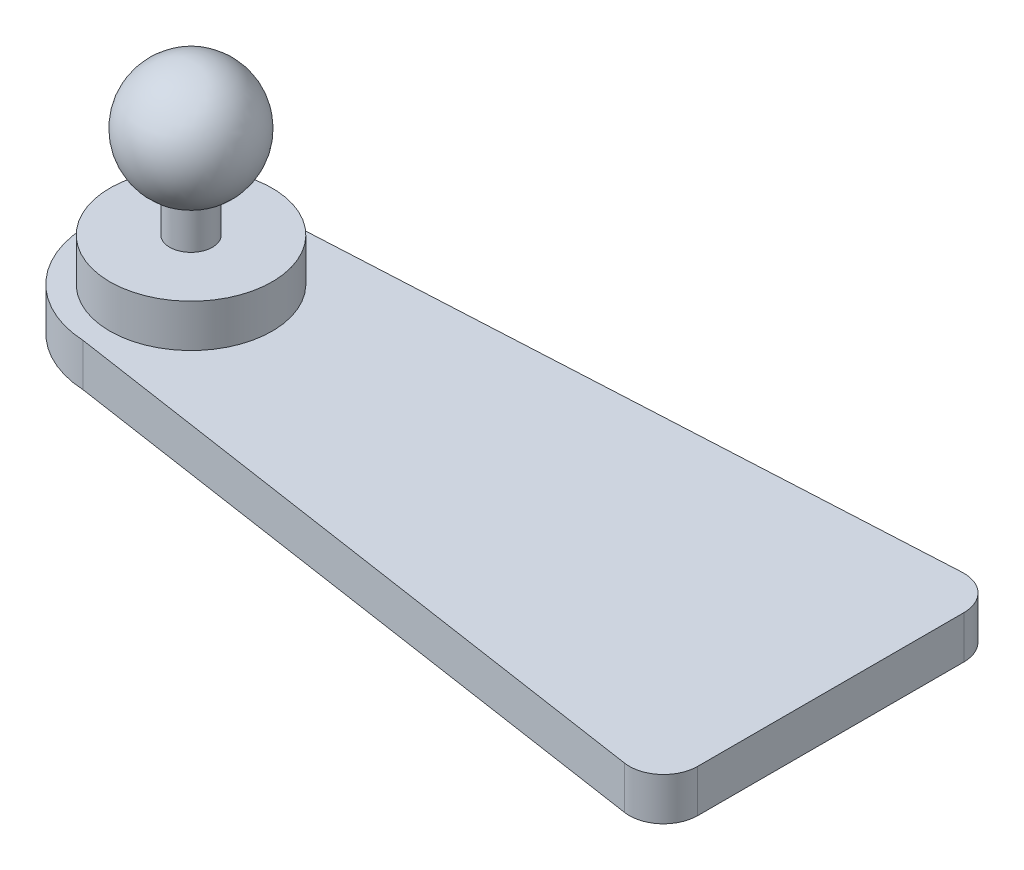
ISO-10303-21;
HEADER;
FILE_DESCRIPTION(('STEP AP214'),'2;1');
FILE_NAME('part.step','',(''),(''),'','','');
FILE_SCHEMA(('AUTOMOTIVE_DESIGN { 1 0 10303 214 1 1 1 1 }'));
ENDSEC;
DATA;
#1=APPLICATION_CONTEXT('core data for automotive mechanical design processes');
#2=APPLICATION_PROTOCOL_DEFINITION('international standard','automotive_design',2000,#1);
#3=PRODUCT_CONTEXT('',#1,'mechanical');
#4=PRODUCT('Part','Part','',(#3));
#5=PRODUCT_RELATED_PRODUCT_CATEGORY('part','',(#4));
#6=PRODUCT_DEFINITION_FORMATION('','',#4);
#7=PRODUCT_DEFINITION_CONTEXT('part definition',#1,'design');
#8=PRODUCT_DEFINITION('design','',#6,#7);
#9=PRODUCT_DEFINITION_SHAPE('','',#8);
#10=(LENGTH_UNIT() NAMED_UNIT(*) SI_UNIT(.MILLI.,.METRE.));
#11=(NAMED_UNIT(*) PLANE_ANGLE_UNIT() SI_UNIT($,.RADIAN.));
#12=(NAMED_UNIT(*) SI_UNIT($,.STERADIAN.) SOLID_ANGLE_UNIT());
#13=UNCERTAINTY_MEASURE_WITH_UNIT(LENGTH_MEASURE(1.E-05),#10,'distance_accuracy_value','');
#14=(GEOMETRIC_REPRESENTATION_CONTEXT(3) GLOBAL_UNCERTAINTY_ASSIGNED_CONTEXT((#13)) GLOBAL_UNIT_ASSIGNED_CONTEXT((#10,
#11,#12)) REPRESENTATION_CONTEXT('',''));
#15=CARTESIAN_POINT('',(0.,0.,0.));
#16=DIRECTION('',(0.,0.,1.));
#17=DIRECTION('',(1.,0.,0.));
#18=AXIS2_PLACEMENT_3D('',#15,#16,#17);
#19=CARTESIAN_POINT('',(15.8376395718531,3.175,-15.5747968755343));
#20=DIRECTION('',(0.052455693553448,0.,0.998623252389922));
#21=DIRECTION('',(0.998623252389922,0.,-0.052455693553448));
#22=AXIS2_PLACEMENT_3D('',#19,#20,#21);
#23=PLANE('',#22);
#24=DIRECTION('',(-0.998623252389923,0.,0.052455693553448));
#25=VECTOR('',#24,1.);
#26=CARTESIAN_POINT('',(15.8376395718531,3.175,-15.5747968755343));
#27=LINE('',#26,#25);
#28=CARTESIAN_POINT('',(13.1644021102273,3.175,-15.4343770277618));
#29=VERTEX_POINT('',#28);
#30=CARTESIAN_POINT('',(-34.4025316455696,3.175,-12.9357805907173));
#31=VERTEX_POINT('',#30);
#32=EDGE_CURVE('E105',#29,#31,#27,.T.);
#33=ORIENTED_EDGE('',*,*,#32,.F.);
#34=DIRECTION('',(0.,-1.,0.));
#35=VECTOR('',#34,1.);
#36=CARTESIAN_POINT('',(13.1644021102273,3.175,-15.4343770277618));
#37=LINE('',#36,#35);
#38=CARTESIAN_POINT('',(13.1644021102273,0.,-15.4343770277618));
#39=VERTEX_POINT('',#38);
#40=EDGE_CURVE('E132',#29,#39,#37,.T.);
#41=ORIENTED_EDGE('',*,*,#40,.T.);
#42=DIRECTION('',(-0.998623252389923,0.,0.052455693553448));
#43=VECTOR('',#42,1.);
#44=CARTESIAN_POINT('',(15.8376395718531,0.,-15.5747968755343));
#45=LINE('',#44,#43);
#46=CARTESIAN_POINT('',(-34.4025316455696,0.,-12.9357805907173));
#47=VERTEX_POINT('',#46);
#48=EDGE_CURVE('E129',#39,#47,#45,.T.);
#49=ORIENTED_EDGE('',*,*,#48,.T.);
#50=DIRECTION('',(0.,-1.,0.));
#51=VECTOR('',#50,1.);
#52=CARTESIAN_POINT('',(-34.4025316455696,3.175,-12.9357805907173));
#53=LINE('',#52,#51);
#54=EDGE_CURVE('E122',#31,#47,#53,.T.);
#55=ORIENTED_EDGE('',*,*,#54,.F.);
#56=EDGE_LOOP('',(#33,#41,#49,#55));
#57=FACE_BOUND('',#56,.T.);
#58=ADVANCED_FACE('F42',(#57),#23,.F.);
#59=CARTESIAN_POINT('',(-34.0022681989488,3.175,-5.3157805907173));
#60=DIRECTION('',(0.,-1.,0.));
#61=DIRECTION('',(0.,0.,-1.));
#62=AXIS2_PLACEMENT_3D('',#59,#60,#61);
#63=CYLINDRICAL_SURFACE('',#62,7.6305052799078);
#64=CARTESIAN_POINT('',(-34.0022681989488,0.,-5.3157805907173));
#65=DIRECTION('',(0.,1.,0.));
#66=DIRECTION('',(0.,0.,1.));
#67=AXIS2_PLACEMENT_3D('',#64,#65,#66);
#68=CIRCLE('',#67,7.6305052799078);
#69=CARTESIAN_POINT('',(-34.4025316455696,0.,2.3042194092827));
#70=VERTEX_POINT('',#69);
#71=EDGE_CURVE('E181',#47,#70,#68,.T.);
#72=ORIENTED_EDGE('',*,*,#71,.T.);
#73=DIRECTION('',(0.,-1.,0.));
#74=VECTOR('',#73,1.);
#75=CARTESIAN_POINT('',(-34.4025316455696,3.175,2.3042194092827));
#76=LINE('',#75,#74);
#77=CARTESIAN_POINT('',(-34.4025316455696,3.175,2.3042194092827));
#78=VERTEX_POINT('',#77);
#79=EDGE_CURVE('E124',#78,#70,#76,.T.);
#80=ORIENTED_EDGE('',*,*,#79,.F.);
#81=CARTESIAN_POINT('',(-34.0022681989488,3.175,-5.3157805907173));
#82=DIRECTION('',(0.,1.,0.));
#83=DIRECTION('',(0.,0.,1.));
#84=AXIS2_PLACEMENT_3D('',#81,#82,#83);
#85=CIRCLE('',#84,7.6305052799078);
#86=EDGE_CURVE('E108',#31,#78,#85,.T.);
#87=ORIENTED_EDGE('',*,*,#86,.F.);
#88=ORIENTED_EDGE('',*,*,#54,.T.);
#89=EDGE_LOOP('',(#72,#80,#87,#88));
#90=FACE_BOUND('',#89,.T.);
#91=ADVANCED_FACE('F121',(#90),#63,.T.);
#92=CARTESIAN_POINT('',(15.8376395718531,3.175,9.82520312446574));
#93=DIRECTION('',(0.148050860535099,0.,-0.988979748374463));
#94=DIRECTION('',(-0.988979748374463,0.,-0.148050860535099));
#95=AXIS2_PLACEMENT_3D('',#92,#93,#94);
#96=PLANE('',#95);
#97=DIRECTION('',(0.988979748374463,0.,0.148050860535099));
#98=VECTOR('',#97,1.);
#99=CARTESIAN_POINT('',(15.8376395718531,0.,9.82520312446574));
#100=LINE('',#99,#98);
#101=CARTESIAN_POINT('',(12.9215903860939,0.,9.38866881522036));
#102=VERTEX_POINT('',#101);
#103=EDGE_CURVE('E178',#70,#102,#100,.T.);
#104=ORIENTED_EDGE('',*,*,#103,.T.);
#105=DIRECTION('',(0.,-1.,0.));
#106=VECTOR('',#105,1.);
#107=CARTESIAN_POINT('',(12.9215903860939,3.175,9.38866881522036));
#108=LINE('',#107,#106);
#109=CARTESIAN_POINT('',(12.9215903860939,3.175,9.38866881522036));
#110=VERTEX_POINT('',#109);
#111=EDGE_CURVE('E57',#102,#110,#108,.F.);
#112=ORIENTED_EDGE('',*,*,#111,.T.);
#113=DIRECTION('',(0.988979748374463,0.,0.148050860535099));
#114=VECTOR('',#113,1.);
#115=CARTESIAN_POINT('',(15.8376395718531,3.175,9.82520312446574));
#116=LINE('',#115,#114);
#117=EDGE_CURVE('E126',#78,#110,#116,.T.);
#118=ORIENTED_EDGE('',*,*,#117,.F.);
#119=ORIENTED_EDGE('',*,*,#79,.T.);
#120=EDGE_LOOP('',(#104,#112,#118,#119));
#121=FACE_BOUND('',#120,.T.);
#122=ADVANCED_FACE('F179',(#121),#96,.F.);
#123=CARTESIAN_POINT('',(15.8376395718531,3.175,-15.5747968755343));
#124=DIRECTION('',(-1.,0.,0.));
#125=DIRECTION('',(0.,0.,1.));
#126=AXIS2_PLACEMENT_3D('',#123,#124,#125);
#127=PLANE('',#126);
#128=DIRECTION('',(0.,0.,-1.));
#129=VECTOR('',#128,1.);
#130=CARTESIAN_POINT('',(15.8376395718531,0.,-15.5747968755343));
#131=LINE('',#130,#129);
#132=CARTESIAN_POINT('',(15.8376395718531,0.,6.87666025434922));
#133=VERTEX_POINT('',#132);
#134=CARTESIAN_POINT('',(15.8376395718531,0.,-12.8978739666914));
#135=VERTEX_POINT('',#134);
#136=EDGE_CURVE('E117',#133,#135,#131,.T.);
#137=ORIENTED_EDGE('',*,*,#136,.T.);
#138=DIRECTION('',(0.,-1.,0.));
#139=VECTOR('',#138,1.);
#140=CARTESIAN_POINT('',(15.8376395718531,3.175,-12.8978739666914));
#141=LINE('',#140,#139);
#142=CARTESIAN_POINT('',(15.8376395718531,3.175,-12.8978739666914));
#143=VERTEX_POINT('',#142);
#144=EDGE_CURVE('E72',#135,#143,#141,.F.);
#145=ORIENTED_EDGE('',*,*,#144,.T.);
#146=DIRECTION('',(0.,0.,-1.));
#147=VECTOR('',#146,1.);
#148=CARTESIAN_POINT('',(15.8376395718531,3.175,-15.5747968755343));
#149=LINE('',#148,#147);
#150=CARTESIAN_POINT('',(15.8376395718531,3.175,6.87666025434922));
#151=VERTEX_POINT('',#150);
#152=EDGE_CURVE('E139',#151,#143,#149,.T.);
#153=ORIENTED_EDGE('',*,*,#152,.F.);
#154=DIRECTION('',(0.,-1.,0.));
#155=VECTOR('',#154,1.);
#156=CARTESIAN_POINT('',(15.8376395718531,3.175,6.87666025434922));
#157=LINE('',#156,#155);
#158=EDGE_CURVE('E148',#151,#133,#157,.T.);
#159=ORIENTED_EDGE('',*,*,#158,.T.);
#160=EDGE_LOOP('',(#137,#145,#153,#159));
#161=FACE_BOUND('',#160,.T.);
#162=ADVANCED_FACE('F171',(#161),#127,.F.);
#163=CARTESIAN_POINT('',(-34.0022681989488,3.175,-5.3157805907173));
#164=DIRECTION('',(0.,1.,0.));
#165=DIRECTION('',(0.,0.,1.));
#166=AXIS2_PLACEMENT_3D('',#163,#164,#165);
#167=PLANE('',#166);
#168=CARTESIAN_POINT('',(-34.0022681989488,3.175,-5.3157805907173));
#169=DIRECTION('',(0.,1.,0.));
#170=DIRECTION('',(0.,0.,1.));
#171=AXIS2_PLACEMENT_3D('',#168,#169,#170);
#172=CIRCLE('',#171,6.0325);
#173=CARTESIAN_POINT('',(-34.0022681989488,3.175,0.716719409282703));
#174=VERTEX_POINT('',#173);
#175=EDGE_CURVE('E193',#174,#174,#172,.T.);
#176=ORIENTED_EDGE('',*,*,#175,.F.);
#177=EDGE_LOOP('',(#176));
#178=FACE_BOUND('',#177,.T.);
#179=ORIENTED_EDGE('',*,*,#152,.T.);
#180=CARTESIAN_POINT('',(13.2976395718531,3.175,-12.8978739666914));
#181=DIRECTION('',(0.,1.,0.));
#182=DIRECTION('',(0.,0.,1.));
#183=AXIS2_PLACEMENT_3D('',#180,#181,#182);
#184=CIRCLE('',#183,2.54);
#185=EDGE_CURVE('E111',#143,#29,#184,.T.);
#186=ORIENTED_EDGE('',*,*,#185,.T.);
#187=ORIENTED_EDGE('',*,*,#32,.T.);
#188=ORIENTED_EDGE('',*,*,#86,.T.);
#189=ORIENTED_EDGE('',*,*,#117,.T.);
#190=CARTESIAN_POINT('',(13.2976395718531,3.175,6.87666025434922));
#191=DIRECTION('',(0.,1.,0.));
#192=DIRECTION('',(0.,0.,1.));
#193=AXIS2_PLACEMENT_3D('',#190,#191,#192);
#194=CIRCLE('',#193,2.54);
#195=EDGE_CURVE('E154',#110,#151,#194,.T.);
#196=ORIENTED_EDGE('',*,*,#195,.T.);
#197=EDGE_LOOP('',(#179,#186,#187,#188,#189,#196));
#198=FACE_BOUND('',#197,.T.);
#199=ADVANCED_FACE('F107',(#178,#198),#167,.T.);
#200=CARTESIAN_POINT('',(-34.0022681989488,0.,-5.3157805907173));
#201=DIRECTION('',(0.,1.,0.));
#202=DIRECTION('',(0.,0.,1.));
#203=AXIS2_PLACEMENT_3D('',#200,#201,#202);
#204=PLANE('',#203);
#205=ORIENTED_EDGE('',*,*,#48,.F.);
#206=CARTESIAN_POINT('',(13.2976395718531,0.,-12.8978739666914));
#207=DIRECTION('',(0.,1.,0.));
#208=DIRECTION('',(0.,0.,1.));
#209=AXIS2_PLACEMENT_3D('',#206,#207,#208);
#210=CIRCLE('',#209,2.54);
#211=EDGE_CURVE('E145',#39,#135,#210,.F.);
#212=ORIENTED_EDGE('',*,*,#211,.T.);
#213=ORIENTED_EDGE('',*,*,#136,.F.);
#214=CARTESIAN_POINT('',(13.2976395718531,0.,6.87666025434922));
#215=DIRECTION('',(0.,1.,0.));
#216=DIRECTION('',(0.,0.,1.));
#217=AXIS2_PLACEMENT_3D('',#214,#215,#216);
#218=CIRCLE('',#217,2.54);
#219=EDGE_CURVE('E137',#133,#102,#218,.F.);
#220=ORIENTED_EDGE('',*,*,#219,.T.);
#221=ORIENTED_EDGE('',*,*,#103,.F.);
#222=ORIENTED_EDGE('',*,*,#71,.F.);
#223=EDGE_LOOP('',(#205,#212,#213,#220,#221,#222));
#224=FACE_BOUND('',#223,.T.);
#225=ADVANCED_FACE('F177',(#224),#204,.F.);
#226=CARTESIAN_POINT('',(13.2976395718531,3.175,-12.8978739666914));
#227=DIRECTION('',(0.,-1.,0.));
#228=DIRECTION('',(0.,0.,-1.));
#229=AXIS2_PLACEMENT_3D('',#226,#227,#228);
#230=CYLINDRICAL_SURFACE('',#229,2.54);
#231=ORIENTED_EDGE('',*,*,#185,.F.);
#232=ORIENTED_EDGE('',*,*,#144,.F.);
#233=ORIENTED_EDGE('',*,*,#211,.F.);
#234=ORIENTED_EDGE('',*,*,#40,.F.);
#235=EDGE_LOOP('',(#231,#232,#233,#234));
#236=FACE_BOUND('',#235,.T.);
#237=ADVANCED_FACE('F216',(#236),#230,.T.);
#238=CARTESIAN_POINT('',(13.2976395718531,3.175,6.87666025434922));
#239=DIRECTION('',(0.,-1.,0.));
#240=DIRECTION('',(0.,0.,-1.));
#241=AXIS2_PLACEMENT_3D('',#238,#239,#240);
#242=CYLINDRICAL_SURFACE('',#241,2.54);
#243=ORIENTED_EDGE('',*,*,#195,.F.);
#244=ORIENTED_EDGE('',*,*,#111,.F.);
#245=ORIENTED_EDGE('',*,*,#219,.F.);
#246=ORIENTED_EDGE('',*,*,#158,.F.);
#247=EDGE_LOOP('',(#243,#244,#245,#246));
#248=FACE_BOUND('',#247,.T.);
#249=ADVANCED_FACE('F44',(#248),#242,.T.);
#250=CARTESIAN_POINT('',(-34.0022681989488,6.35,-5.3157805907173));
#251=DIRECTION('',(0.,-1.,0.));
#252=DIRECTION('',(0.,0.,-1.));
#253=AXIS2_PLACEMENT_3D('',#250,#251,#252);
#254=CYLINDRICAL_SURFACE('',#253,6.0325);
#255=CARTESIAN_POINT('',(-34.0022681989488,6.35,-5.3157805907173));
#256=DIRECTION('',(0.,1.,0.));
#257=DIRECTION('',(0.,0.,1.));
#258=AXIS2_PLACEMENT_3D('',#255,#256,#257);
#259=CIRCLE('',#258,6.0325);
#260=CARTESIAN_POINT('',(-34.0022681989488,6.35,0.716719409282703));
#261=VERTEX_POINT('',#260);
#262=EDGE_CURVE('E189',#261,#261,#259,.T.);
#263=ORIENTED_EDGE('',*,*,#262,.F.);
#264=EDGE_LOOP('',(#263));
#265=FACE_BOUND('',#264,.T.);
#266=ORIENTED_EDGE('',*,*,#175,.T.);
#267=EDGE_LOOP('',(#266));
#268=FACE_BOUND('',#267,.T.);
#269=ADVANCED_FACE('F204',(#265,#268),#254,.T.);
#270=CARTESIAN_POINT('',(-34.0022681989488,6.35,-5.3157805907173));
#271=DIRECTION('',(0.,1.,0.));
#272=DIRECTION('',(0.,0.,1.));
#273=AXIS2_PLACEMENT_3D('',#270,#271,#272);
#274=PLANE('',#273);
#275=CARTESIAN_POINT('',(-34.0022681989488,6.35,-5.3157805907173));
#276=DIRECTION('',(0.,1.,0.));
#277=DIRECTION('',(0.,0.,1.));
#278=AXIS2_PLACEMENT_3D('',#275,#276,#277);
#279=CIRCLE('',#278,1.5875);
#280=CARTESIAN_POINT('',(-34.0022681989488,6.35,-3.7282805907173));
#281=VERTEX_POINT('',#280);
#282=EDGE_CURVE('E11',#281,#281,#279,.T.);
#283=ORIENTED_EDGE('',*,*,#282,.F.);
#284=EDGE_LOOP('',(#283));
#285=FACE_BOUND('',#284,.T.);
#286=ORIENTED_EDGE('',*,*,#262,.T.);
#287=EDGE_LOOP('',(#286));
#288=FACE_BOUND('',#287,.T.);
#289=ADVANCED_FACE('F202',(#285,#288),#274,.T.);
#290=CARTESIAN_POINT('',(-34.0022681989488,9.525,-5.3157805907173));
#291=DIRECTION('',(0.,-1.,0.));
#292=DIRECTION('',(0.,0.,-1.));
#293=AXIS2_PLACEMENT_3D('',#290,#291,#292);
#294=CYLINDRICAL_SURFACE('',#293,1.5875);
#295=CARTESIAN_POINT('',(-35.1247875970185,9.19072907510531,-6.43832522277398));
#296=CARTESIAN_POINT('',(-35.0617309261492,9.19082370141128,-6.50137488410129));
#297=CARTESIAN_POINT('',(-34.9933037765543,9.19092639000714,-6.5591453745974));
#298=CARTESIAN_POINT('',(-34.8476636470383,9.19114496181527,-6.66242471030995));
#299=CARTESIAN_POINT('',(-34.7704401847108,9.19126086077019,-6.70791870378398));
#300=CARTESIAN_POINT('',(-34.6094801883373,9.19150244500009,-6.78527556492265));
#301=CARTESIAN_POINT('',(-34.525746780734,9.19162812557742,-6.81714492869144));
#302=CARTESIAN_POINT('',(-34.3541408467073,9.19188571240131,-6.86636402830852));
#303=CARTESIAN_POINT('',(-34.2662693539771,9.19201761709309,-6.88371737014787));
#304=CARTESIAN_POINT('',(-34.0888503867803,9.19228395529341,-6.90342875226136));
#305=CARTESIAN_POINT('',(-33.9993027368659,9.19241838906668,-6.90578521387062));
#306=CARTESIAN_POINT('',(-33.8210794033218,9.19268596179794,-6.89543087139658));
#307=CARTESIAN_POINT('',(-33.7324037540682,9.19281910070488,-6.88271947568597));
#308=CARTESIAN_POINT('',(-33.5584467935548,9.19308029409783,-6.84258983821222));
#309=CARTESIAN_POINT('',(-33.473165420017,9.19320834867712,-6.81517186641838));
#310=CARTESIAN_POINT('',(-33.3084163803006,9.19345573998532,-6.74640758326267));
#311=CARTESIAN_POINT('',(-33.2289487024233,9.19357507673176,-6.70506129992913));
#312=CARTESIAN_POINT('',(-33.0780826017645,9.19380164117016,-6.60961401564683));
#313=CARTESIAN_POINT('',(-33.0066841906871,9.19390886884455,-6.55551299619809));
#314=CARTESIAN_POINT('',(-32.8739836824231,9.19410816886894,-6.43609214444938));
#315=CARTESIAN_POINT('',(-32.8126815669945,9.19420024124632,-6.37077233241992));
#316=CARTESIAN_POINT('',(-32.7019137205965,9.19436661247613,-6.23076810454122));
#317=CARTESIAN_POINT('',(-32.6524479824269,9.19444091133937,-6.15608369438877));
#318=CARTESIAN_POINT('',(-32.5667569920811,9.19456962470911,-5.99947022386515));
#319=CARTESIAN_POINT('',(-32.5305317538018,9.19462403919474,-5.91754115589035));
#320=CARTESIAN_POINT('',(-32.4723502149523,9.19471143513908,-5.74876428767038));
#321=CARTESIAN_POINT('',(-32.4503938943738,9.19474441662785,-5.66191649432262));
#322=CARTESIAN_POINT('',(-32.4213733961322,9.19478801011439,-5.48576746298257));
#323=CARTESIAN_POINT('',(-32.4143092123712,9.19479862212133,-5.39646622599491));
#324=CARTESIAN_POINT('',(-32.4152735023643,9.19479717359045,-5.21794532642836));
#325=CARTESIAN_POINT('',(-32.4233019676275,9.19478511306538,-5.1287256638036));
#326=CARTESIAN_POINT('',(-32.4542236348181,9.19473866376556,-4.95290053499524));
#327=CARTESIAN_POINT('',(-32.47711683867,9.19470427498792,-4.86629506915008));
#328=CARTESIAN_POINT('',(-32.5371181082663,9.1946141457707,-4.69815682435823));
#329=CARTESIAN_POINT('',(-32.5742261731847,9.19455840533235,-4.61662404511672));
#330=CARTESIAN_POINT('',(-32.6616037691398,9.19442715897977,-4.46094564249699));
#331=CARTESIAN_POINT('',(-32.7118732996202,9.19435165306636,-4.38680001880646));
#332=CARTESIAN_POINT('',(-32.8241468575396,9.19418302096805,-4.24800064388452));
#333=CARTESIAN_POINT('',(-32.8861508929081,9.19408989477124,-4.18334689906727));
#334=CARTESIAN_POINT('',(-33.0201333261167,9.19388867041981,-4.06536665948927));
#335=CARTESIAN_POINT('',(-33.0921117244617,9.19378057226444,-4.01204016530182));
#336=CARTESIAN_POINT('',(-33.2439997118886,9.19355247441744,-3.91822815017287));
#337=CARTESIAN_POINT('',(-33.3239093097974,9.19343247471255,-3.87774264352262));
#338=CARTESIAN_POINT('',(-33.4893912204408,9.1931839843629,-3.81076194525163));
#339=CARTESIAN_POINT('',(-33.5749635324688,9.19305549371919,-3.7842667518851));
#340=CARTESIAN_POINT('',(-33.7493418141431,9.19279366945125,-3.74601876994317));
#341=CARTESIAN_POINT('',(-33.8381477865635,9.19266033582286,-3.73426599401499));
#342=CARTESIAN_POINT('',(-34.0164724185666,9.19239261276041,-3.72583651117202));
#343=CARTESIAN_POINT('',(-34.1059910784405,9.19225822332591,-3.72915981041486));
#344=CARTESIAN_POINT('',(-34.2831999516978,9.19199220196189,-3.75078816285225));
#345=CARTESIAN_POINT('',(-34.370890163602,9.19186057003459,-3.7690932281679));
#346=CARTESIAN_POINT('',(-34.5419527041626,9.19160380051361,-3.82016547704941));
#347=CARTESIAN_POINT('',(-34.6253250373779,9.19147866291307,-3.85293264534561));
#348=CARTESIAN_POINT('',(-34.7853851743403,9.19123843063941,-3.93199891400512));
#349=CARTESIAN_POINT('',(-34.8620729821802,9.19112333596015,-3.97829800608274));
#350=CARTESIAN_POINT('',(-35.0065873114666,9.19090645475206,-4.08311393818742));
#351=CARTESIAN_POINT('',(-35.07441381698,9.19080466824715,-4.14163080018215));
#352=CARTESIAN_POINT('',(-35.199279799975,9.19061728867674,-4.26922091912103));
#353=CARTESIAN_POINT('',(-35.25631930726,9.19053169556648,-4.33829414689814));
#354=CARTESIAN_POINT('',(-35.3579924284878,9.1903791299637,-4.48503649449204));
#355=CARTESIAN_POINT('',(-35.4026260175577,9.1903121575085,-4.56270563154252));
#356=CARTESIAN_POINT('',(-35.4782208237487,9.19019872925999,-4.72443625772847));
#357=CARTESIAN_POINT('',(-35.5091818012191,9.19015227382629,-4.80849785887949));
#358=CARTESIAN_POINT('',(-35.5565502313172,9.19008120107222,-4.98062265016814));
#359=CARTESIAN_POINT('',(-35.5729582553633,9.19005658289441,-5.06868568304775));
#360=CARTESIAN_POINT('',(-35.5907566940004,9.19002987843168,-5.24630658021309));
#361=CARTESIAN_POINT('',(-35.5921486926151,9.19002778977015,-5.33586428582921));
#362=CARTESIAN_POINT('',(-35.5798761965187,9.1900462032824,-5.51396658596191));
#363=CARTESIAN_POINT('',(-35.5662079594672,9.19006671107121,-5.60251092313972));
#364=CARTESIAN_POINT('',(-35.5241943422582,9.1901297490256,-5.77608213770819));
#365=CARTESIAN_POINT('',(-35.4958419602867,9.19017228969709,-5.86110731615965));
#366=CARTESIAN_POINT('',(-35.4252769390122,9.1902781700643,-6.02511379717766));
#367=CARTESIAN_POINT('',(-35.3830810137801,9.1903414846785,-6.10410224712117));
#368=CARTESIAN_POINT('',(-35.3043046794926,9.19045969104917,-6.22570921178919));
#369=CARTESIAN_POINT('',(-35.2715548904679,9.19050883380313,-6.27085638447186));
#370=CARTESIAN_POINT('',(-35.2014983176974,9.19061395997448,-6.35746461161893));
#371=CARTESIAN_POINT('',(-35.164191533952,9.19066994339187,-6.39892566608358));
#372=CARTESIAN_POINT('',(-35.1247875970185,9.19072907510531,-6.43832522277398));
#373=B_SPLINE_CURVE_WITH_KNOTS('',3,(#295,#296,#297,#298,#299,#300,#301,#302,#303,#304,#305,
#306,#307,#308,#309,#310,#311,#312,#313,#314,#315,#316,#317,#318,#319,#320,#321,#322,#323,#324,
#325,#326,#327,#328,#329,#330,#331,#332,#333,#334,#335,#336,#337,#338,#339,#340,#341,#342,#343,
#344,#345,#346,#347,#348,#349,#350,#351,#352,#353,#354,#355,#356,#357,#358,#359,#360,#361,#362,
#363,#364,#365,#366,#367,#368,#369,#370,#371,#372),.UNSPECIFIED.,.T.,.F.,(4,2,2,2,2,2,2,2,2,2,2,
2,2,2,2,2,2,2,2,2,2,2,2,2,2,2,2,2,2,2,2,2,2,2,2,2,2,2,4),(0.,0.267308691414162,
0.534939329764335,0.802442221470875,1.06987864181584,1.33734321371588,1.60481828774516,
1.87228845189011,2.1397580778006,2.40722809166193,2.67469762225369,2.94216699013589,
3.20963663874398,3.47710591229561,3.7445750763252,4.01204408988123,4.27951313806485,
4.54698217070407,4.81445119203596,5.08192039411005,5.34938960972145,5.61685912300876,
5.8843286029196,6.1517983122871,6.41926813089935,6.68673816591014,6.95420791851611,
7.22167750734906,7.48914757709919,7.75661690784766,8.02408677484704,8.29156132981795,
8.55902538199895,8.82646121942118,9.09396352736225,9.36159350553232,9.62890154117931,
9.79594199342291,9.96298244565522),.UNSPECIFIED.);
#374=CARTESIAN_POINT('',(-35.1247875970185,9.19072907510531,-6.43832522277398));
#375=VERTEX_POINT('',#374);
#376=EDGE_CURVE('E46',#375,#375,#373,.T.);
#377=ORIENTED_EDGE('',*,*,#376,.T.);
#378=EDGE_LOOP('',(#377));
#379=FACE_BOUND('',#378,.T.);
#380=ORIENTED_EDGE('',*,*,#282,.T.);
#381=EDGE_LOOP('',(#380));
#382=FACE_BOUND('',#381,.T.);
#383=ADVANCED_FACE('F243',(#379,#382),#294,.T.);
#384=CARTESIAN_POINT('',(-34.0082967260133,13.208,-5.3157805907173));
#385=DIRECTION('',(0.,1.,0.));
#386=DIRECTION('',(1.,0.,0.));
#387=AXIS2_PLACEMENT_3D('',#384,#385,#386);
#388=SPHERICAL_SURFACE('',#387,4.318);
#389=ORIENTED_EDGE('',*,*,#376,.F.);
#390=EDGE_LOOP('',(#389));
#391=FACE_BOUND('',#390,.T.);
#392=ADVANCED_FACE('F251',(#391),#388,.T.);
#393=CLOSED_SHELL('',(#58,#91,#122,#162,#199,#225,#237,#249,#269,#289,#383,#392));
#394=MANIFOLD_SOLID_BREP('B2',#393);
#395=ADVANCED_BREP_SHAPE_REPRESENTATION('',(#18,#394),#14);
#396=SHAPE_DEFINITION_REPRESENTATION(#9,#395);
ENDSEC;
END-ISO-10303-21;
